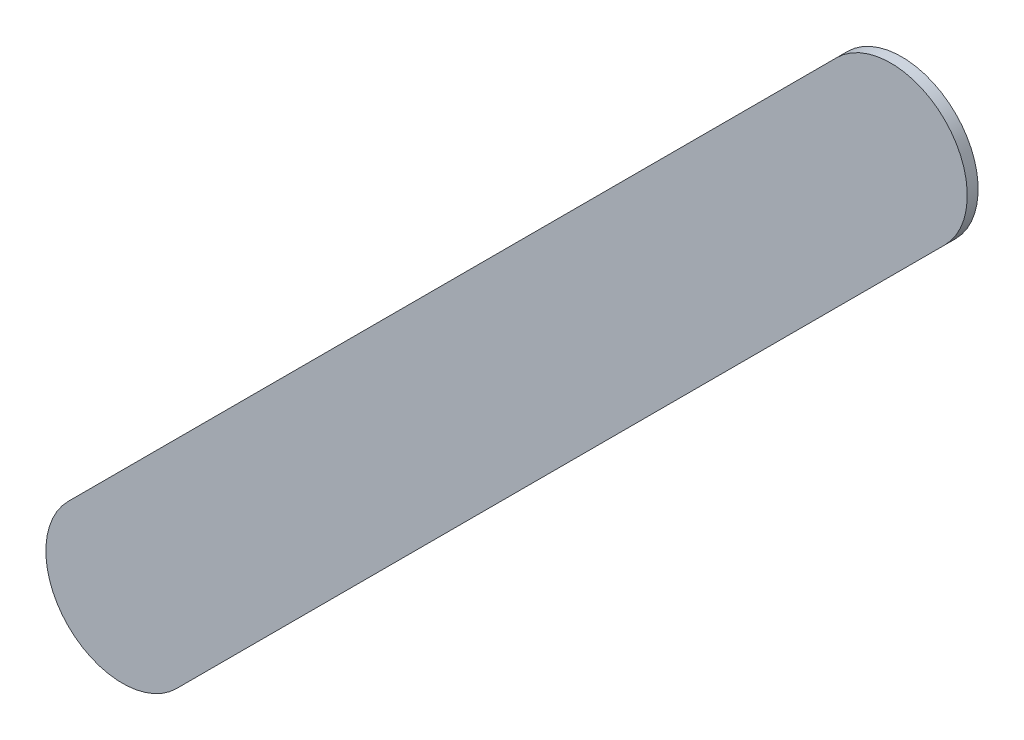
ISO-10303-21;
HEADER;
FILE_DESCRIPTION(('STEP AP214'),'2;1');
FILE_NAME('part.step','',(''),(''),'','','');
FILE_SCHEMA(('AUTOMOTIVE_DESIGN { 1 0 10303 214 1 1 1 1 }'));
ENDSEC;
DATA;
#1=APPLICATION_CONTEXT('core data for automotive mechanical design processes');
#2=APPLICATION_PROTOCOL_DEFINITION('international standard','automotive_design',2000,#1);
#3=PRODUCT_CONTEXT('',#1,'mechanical');
#4=PRODUCT('Part','Part','',(#3));
#5=PRODUCT_RELATED_PRODUCT_CATEGORY('part','',(#4));
#6=PRODUCT_DEFINITION_FORMATION('','',#4);
#7=PRODUCT_DEFINITION_CONTEXT('part definition',#1,'design');
#8=PRODUCT_DEFINITION('design','',#6,#7);
#9=PRODUCT_DEFINITION_SHAPE('','',#8);
#10=(LENGTH_UNIT() NAMED_UNIT(*) SI_UNIT(.MILLI.,.METRE.));
#11=(NAMED_UNIT(*) PLANE_ANGLE_UNIT() SI_UNIT($,.RADIAN.));
#12=(NAMED_UNIT(*) SI_UNIT($,.STERADIAN.) SOLID_ANGLE_UNIT());
#13=UNCERTAINTY_MEASURE_WITH_UNIT(LENGTH_MEASURE(1.E-05),#10,'distance_accuracy_value','');
#14=(GEOMETRIC_REPRESENTATION_CONTEXT(3) GLOBAL_UNCERTAINTY_ASSIGNED_CONTEXT((#13)) GLOBAL_UNIT_ASSIGNED_CONTEXT((#10,
#11,#12)) REPRESENTATION_CONTEXT('',''));
#15=CARTESIAN_POINT('',(0.,0.,0.));
#16=DIRECTION('',(0.,0.,1.));
#17=DIRECTION('',(1.,0.,0.));
#18=AXIS2_PLACEMENT_3D('',#15,#16,#17);
#19=CARTESIAN_POINT('',(37.06449026,103.31093892,0.));
#20=DIRECTION('',(-0.707106781186547,0.707106781186549,0.));
#21=DIRECTION('',(0.707106781186549,0.707106781186547,0.));
#22=AXIS2_PLACEMENT_3D('',#19,#20,#21);
#23=PLANE('',#22);
#24=DIRECTION('',(0.707106781186549,0.707106781186547,0.));
#25=VECTOR('',#24,1.);
#26=CARTESIAN_POINT('',(37.06449026,103.31093892,0.03556));
#27=LINE('',#26,#25);
#28=CARTESIAN_POINT('',(37.06449026,103.31093892,0.03556));
#29=VERTEX_POINT('',#28);
#30=CARTESIAN_POINT('',(39.57677378,105.82322244,0.03556));
#31=VERTEX_POINT('',#30);
#32=EDGE_CURVE('E11',#29,#31,#27,.T.);
#33=ORIENTED_EDGE('',*,*,#32,.F.);
#34=DIRECTION('',(0.,0.,1.));
#35=VECTOR('',#34,1.);
#36=CARTESIAN_POINT('',(37.06449026,103.31093892,0.));
#37=LINE('',#36,#35);
#38=CARTESIAN_POINT('',(37.06449026,103.31093892,0.));
#39=VERTEX_POINT('',#38);
#40=EDGE_CURVE('E24',#39,#29,#37,.T.);
#41=ORIENTED_EDGE('',*,*,#40,.F.);
#42=DIRECTION('',(0.707106781186549,0.707106781186547,0.));
#43=VECTOR('',#42,1.);
#44=CARTESIAN_POINT('',(37.06449026,103.31093892,0.));
#45=LINE('',#44,#43);
#46=CARTESIAN_POINT('',(39.57677378,105.82322244,0.));
#47=VERTEX_POINT('',#46);
#48=EDGE_CURVE('E75',#39,#47,#45,.T.);
#49=ORIENTED_EDGE('',*,*,#48,.T.);
#50=DIRECTION('',(0.,0.,1.));
#51=VECTOR('',#50,1.);
#52=CARTESIAN_POINT('',(39.57677378,105.82322244,0.));
#53=LINE('',#52,#51);
#54=EDGE_CURVE('E37',#47,#31,#53,.T.);
#55=ORIENTED_EDGE('',*,*,#54,.T.);
#56=EDGE_LOOP('',(#33,#41,#49,#55));
#57=FACE_BOUND('',#56,.T.);
#58=ADVANCED_FACE('F17',(#57),#23,.F.);
#59=CARTESIAN_POINT('',(39.3999974,105.99999882,0.));
#60=DIRECTION('',(0.,0.,-1.));
#61=DIRECTION('',(0.707106781186562,-0.707106781186533,0.));
#62=AXIS2_PLACEMENT_3D('',#59,#60,#61);
#63=CYLINDRICAL_SURFACE('',#62,0.249999554103216);
#64=CARTESIAN_POINT('',(39.3999974,105.99999882,0.03556));
#65=DIRECTION('',(0.,0.,1.));
#66=DIRECTION('',(0.707106781186562,-0.707106781186533,0.));
#67=AXIS2_PLACEMENT_3D('',#64,#65,#66);
#68=CIRCLE('',#67,0.249999554103216);
#69=CARTESIAN_POINT('',(39.22322102,106.1767752,0.03556));
#70=VERTEX_POINT('',#69);
#71=EDGE_CURVE('E83',#31,#70,#68,.T.);
#72=ORIENTED_EDGE('',*,*,#71,.F.);
#73=ORIENTED_EDGE('',*,*,#54,.F.);
#74=CARTESIAN_POINT('',(39.3999974,105.99999882,0.));
#75=DIRECTION('',(0.,0.,1.));
#76=DIRECTION('',(0.707106781186562,-0.707106781186533,0.));
#77=AXIS2_PLACEMENT_3D('',#74,#75,#76);
#78=CIRCLE('',#77,0.249999554103216);
#79=CARTESIAN_POINT('',(39.22322102,106.1767752,0.));
#80=VERTEX_POINT('',#79);
#81=EDGE_CURVE('E81',#47,#80,#78,.T.);
#82=ORIENTED_EDGE('',*,*,#81,.T.);
#83=DIRECTION('',(0.,0.,1.));
#84=VECTOR('',#83,1.);
#85=CARTESIAN_POINT('',(39.22322102,106.1767752,0.));
#86=LINE('',#85,#84);
#87=EDGE_CURVE('E67',#80,#70,#86,.T.);
#88=ORIENTED_EDGE('',*,*,#87,.T.);
#89=EDGE_LOOP('',(#72,#73,#82,#88));
#90=FACE_BOUND('',#89,.T.);
#91=ADVANCED_FACE('F89',(#90),#63,.T.);
#92=CARTESIAN_POINT('',(39.22322102,106.1767752,0.));
#93=DIRECTION('',(0.707106781186546,-0.70710678118655,0.));
#94=DIRECTION('',(-0.70710678118655,-0.707106781186546,0.));
#95=AXIS2_PLACEMENT_3D('',#92,#93,#94);
#96=PLANE('',#95);
#97=DIRECTION('',(-0.70710678118655,-0.707106781186546,0.));
#98=VECTOR('',#97,1.);
#99=CARTESIAN_POINT('',(39.22322102,106.1767752,0.03556));
#100=LINE('',#99,#98);
#101=CARTESIAN_POINT('',(36.7109375,103.66449168,0.03556));
#102=VERTEX_POINT('',#101);
#103=EDGE_CURVE('E71',#70,#102,#100,.T.);
#104=ORIENTED_EDGE('',*,*,#103,.F.);
#105=ORIENTED_EDGE('',*,*,#87,.F.);
#106=DIRECTION('',(-0.70710678118655,-0.707106781186546,0.));
#107=VECTOR('',#106,1.);
#108=CARTESIAN_POINT('',(39.22322102,106.1767752,0.));
#109=LINE('',#108,#107);
#110=CARTESIAN_POINT('',(36.7109375,103.66449168,0.));
#111=VERTEX_POINT('',#110);
#112=EDGE_CURVE('E63',#80,#111,#109,.T.);
#113=ORIENTED_EDGE('',*,*,#112,.T.);
#114=DIRECTION('',(0.,0.,1.));
#115=VECTOR('',#114,1.);
#116=CARTESIAN_POINT('',(36.7109375,103.66449168,0.));
#117=LINE('',#116,#115);
#118=EDGE_CURVE('E53',#111,#102,#117,.T.);
#119=ORIENTED_EDGE('',*,*,#118,.T.);
#120=EDGE_LOOP('',(#104,#105,#113,#119));
#121=FACE_BOUND('',#120,.T.);
#122=ADVANCED_FACE('F66',(#121),#96,.F.);
#123=CARTESIAN_POINT('',(36.88771388,103.4877153,0.));
#124=DIRECTION('',(0.,0.,-1.));
#125=DIRECTION('',(-0.707106781186533,0.707106781186562,0.));
#126=AXIS2_PLACEMENT_3D('',#123,#124,#125);
#127=CYLINDRICAL_SURFACE('',#126,0.249999554103218);
#128=CARTESIAN_POINT('',(36.88771388,103.4877153,0.03556));
#129=DIRECTION('',(0.,0.,1.));
#130=DIRECTION('',(-0.707106781186533,0.707106781186562,0.));
#131=AXIS2_PLACEMENT_3D('',#128,#129,#130);
#132=CIRCLE('',#131,0.249999554103218);
#133=EDGE_CURVE('E59',#102,#29,#132,.T.);
#134=ORIENTED_EDGE('',*,*,#133,.F.);
#135=ORIENTED_EDGE('',*,*,#118,.F.);
#136=CARTESIAN_POINT('',(36.88771388,103.4877153,0.));
#137=DIRECTION('',(0.,0.,1.));
#138=DIRECTION('',(-0.707106781186533,0.707106781186562,0.));
#139=AXIS2_PLACEMENT_3D('',#136,#137,#138);
#140=CIRCLE('',#139,0.249999554103218);
#141=EDGE_CURVE('E57',#111,#39,#140,.T.);
#142=ORIENTED_EDGE('',*,*,#141,.T.);
#143=ORIENTED_EDGE('',*,*,#40,.T.);
#144=EDGE_LOOP('',(#134,#135,#142,#143));
#145=FACE_BOUND('',#144,.T.);
#146=ADVANCED_FACE('F55',(#145),#127,.T.);
#147=CARTESIAN_POINT('',(37.06449026,103.31093892,0.));
#148=DIRECTION('',(0.,0.,-1.));
#149=DIRECTION('',(-1.,0.,0.));
#150=AXIS2_PLACEMENT_3D('',#147,#148,#149);
#151=PLANE('',#150);
#152=ORIENTED_EDGE('',*,*,#141,.F.);
#153=ORIENTED_EDGE('',*,*,#112,.F.);
#154=ORIENTED_EDGE('',*,*,#81,.F.);
#155=ORIENTED_EDGE('',*,*,#48,.F.);
#156=EDGE_LOOP('',(#152,#153,#154,#155));
#157=FACE_BOUND('',#156,.T.);
#158=ADVANCED_FACE('F74',(#157),#151,.T.);
#159=CARTESIAN_POINT('',(37.06449026,103.31093892,0.03556));
#160=DIRECTION('',(0.,0.,-1.));
#161=DIRECTION('',(-1.,0.,0.));
#162=AXIS2_PLACEMENT_3D('',#159,#160,#161);
#163=PLANE('',#162);
#164=ORIENTED_EDGE('',*,*,#32,.T.);
#165=ORIENTED_EDGE('',*,*,#71,.T.);
#166=ORIENTED_EDGE('',*,*,#103,.T.);
#167=ORIENTED_EDGE('',*,*,#133,.T.);
#168=EDGE_LOOP('',(#164,#165,#166,#167));
#169=FACE_BOUND('',#168,.T.);
#170=ADVANCED_FACE('F91',(#169),#163,.F.);
#171=CLOSED_SHELL('',(#58,#91,#122,#146,#158,#170));
#172=MANIFOLD_SOLID_BREP('B1',#171);
#173=ADVANCED_BREP_SHAPE_REPRESENTATION('',(#18,#172),#14);
#174=SHAPE_DEFINITION_REPRESENTATION(#9,#173);
ENDSEC;
END-ISO-10303-21;
